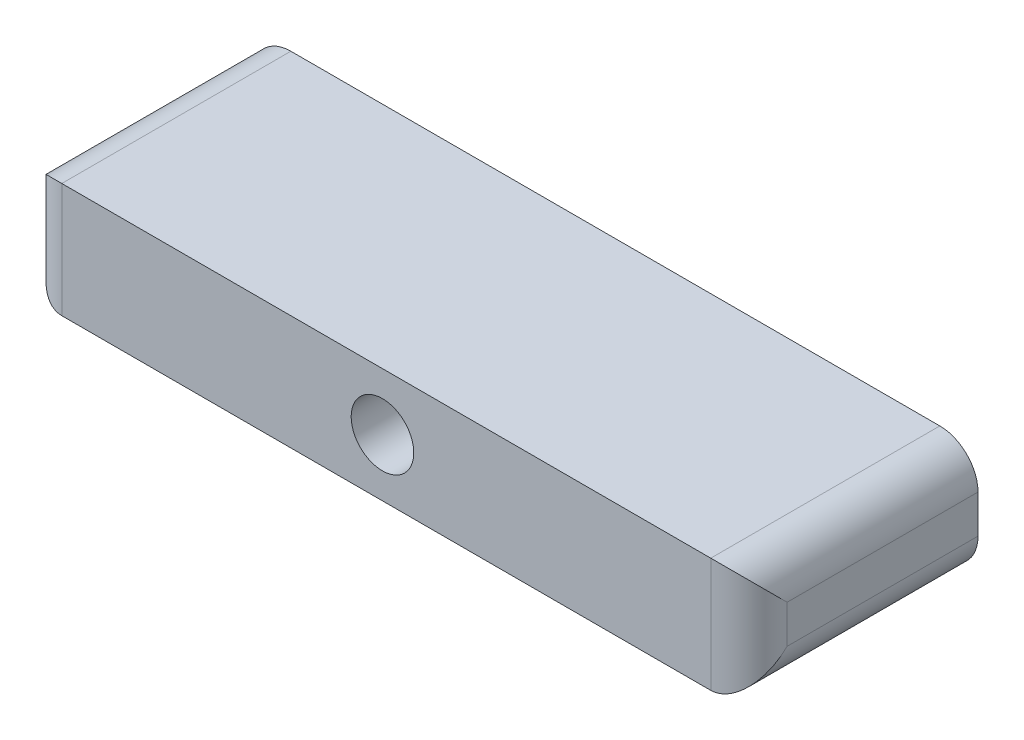
ISO-10303-21;
HEADER;
FILE_DESCRIPTION(('STEP AP214'),'2;1');
FILE_NAME('part.step','',(''),(''),'','','');
FILE_SCHEMA(('AUTOMOTIVE_DESIGN { 1 0 10303 214 1 1 1 1 }'));
ENDSEC;
DATA;
#1=APPLICATION_CONTEXT('core data for automotive mechanical design processes');
#2=APPLICATION_PROTOCOL_DEFINITION('international standard','automotive_design',2000,#1);
#3=PRODUCT_CONTEXT('',#1,'mechanical');
#4=PRODUCT('Part','Part','',(#3));
#5=PRODUCT_RELATED_PRODUCT_CATEGORY('part','',(#4));
#6=PRODUCT_DEFINITION_FORMATION('','',#4);
#7=PRODUCT_DEFINITION_CONTEXT('part definition',#1,'design');
#8=PRODUCT_DEFINITION('design','',#6,#7);
#9=PRODUCT_DEFINITION_SHAPE('','',#8);
#10=(LENGTH_UNIT() NAMED_UNIT(*) SI_UNIT(.MILLI.,.METRE.));
#11=(NAMED_UNIT(*) PLANE_ANGLE_UNIT() SI_UNIT($,.RADIAN.));
#12=(NAMED_UNIT(*) SI_UNIT($,.STERADIAN.) SOLID_ANGLE_UNIT());
#13=UNCERTAINTY_MEASURE_WITH_UNIT(LENGTH_MEASURE(1.E-05),#10,'distance_accuracy_value','');
#14=(GEOMETRIC_REPRESENTATION_CONTEXT(3) GLOBAL_UNCERTAINTY_ASSIGNED_CONTEXT((#13)) GLOBAL_UNIT_ASSIGNED_CONTEXT((#10,
#11,#12)) REPRESENTATION_CONTEXT('',''));
#15=CARTESIAN_POINT('',(0.,0.,0.));
#16=DIRECTION('',(0.,0.,1.));
#17=DIRECTION('',(1.,0.,0.));
#18=AXIS2_PLACEMENT_3D('',#15,#16,#17);
#19=CARTESIAN_POINT('',(0.,15.,0.));
#20=DIRECTION('',(-1.,0.,0.));
#21=DIRECTION('',(0.,0.,1.));
#22=AXIS2_PLACEMENT_3D('',#19,#20,#21);
#23=PLANE('',#22);
#24=DIRECTION('',(0.,-1.,0.));
#25=VECTOR('',#24,1.);
#26=CARTESIAN_POINT('',(0.,15.,25.));
#27=LINE('',#26,#25);
#28=CARTESIAN_POINT('',(0.,10.,25.));
#29=VERTEX_POINT('',#28);
#30=CARTESIAN_POINT('',(0.,5.,25.));
#31=VERTEX_POINT('',#30);
#32=EDGE_CURVE('E57',#29,#31,#27,.T.);
#33=ORIENTED_EDGE('',*,*,#32,.T.);
#34=DIRECTION('',(0.,0.,-1.));
#35=VECTOR('',#34,1.);
#36=CARTESIAN_POINT('',(0.,5.,0.));
#37=LINE('',#36,#35);
#38=CARTESIAN_POINT('',(0.,5.,0.));
#39=VERTEX_POINT('',#38);
#40=EDGE_CURVE('E156',#31,#39,#37,.T.);
#41=ORIENTED_EDGE('',*,*,#40,.T.);
#42=DIRECTION('',(0.,-1.,0.));
#43=VECTOR('',#42,1.);
#44=CARTESIAN_POINT('',(0.,15.,0.));
#45=LINE('',#44,#43);
#46=CARTESIAN_POINT('',(0.,10.,0.));
#47=VERTEX_POINT('',#46);
#48=EDGE_CURVE('E131',#47,#39,#45,.T.);
#49=ORIENTED_EDGE('',*,*,#48,.F.);
#50=DIRECTION('',(0.,0.,-1.));
#51=VECTOR('',#50,1.);
#52=CARTESIAN_POINT('',(0.,10.,0.));
#53=LINE('',#52,#51);
#54=EDGE_CURVE('E62',#47,#29,#53,.F.);
#55=ORIENTED_EDGE('',*,*,#54,.T.);
#56=EDGE_LOOP('',(#33,#41,#49,#55));
#57=FACE_BOUND('',#56,.T.);
#58=ADVANCED_FACE('F39',(#57),#23,.F.);
#59=CARTESIAN_POINT('',(0.,15.,0.));
#60=DIRECTION('',(0.,0.,1.));
#61=DIRECTION('',(1.,0.,0.));
#62=AXIS2_PLACEMENT_3D('',#59,#60,#61);
#63=PLANE('',#62);
#64=CARTESIAN_POINT('',(-48.,7.5,0.));
#65=DIRECTION('',(0.,0.,-1.));
#66=DIRECTION('',(-1.,0.,0.));
#67=AXIS2_PLACEMENT_3D('',#64,#65,#66);
#68=CIRCLE('',#67,4.1);
#69=CARTESIAN_POINT('',(-52.1,7.5,0.));
#70=VERTEX_POINT('',#69);
#71=EDGE_CURVE('E166',#70,#70,#68,.T.);
#72=ORIENTED_EDGE('',*,*,#71,.F.);
#73=EDGE_LOOP('',(#72));
#74=FACE_BOUND('',#73,.T.);
#75=CARTESIAN_POINT('',(-10.,7.,0.));
#76=DIRECTION('',(0.,0.,-1.));
#77=DIRECTION('',(-1.,0.,0.));
#78=AXIS2_PLACEMENT_3D('',#75,#76,#77);
#79=CIRCLE('',#78,4.25);
#80=CARTESIAN_POINT('',(-14.25,7.,0.));
#81=VERTEX_POINT('',#80);
#82=EDGE_CURVE('E387',#81,#81,#79,.T.);
#83=ORIENTED_EDGE('',*,*,#82,.F.);
#84=EDGE_LOOP('',(#83));
#85=FACE_BOUND('',#84,.T.);
#86=CARTESIAN_POINT('',(-85.,7.,0.));
#87=DIRECTION('',(0.,0.,-1.));
#88=DIRECTION('',(-1.,0.,0.));
#89=AXIS2_PLACEMENT_3D('',#86,#87,#88);
#90=CIRCLE('',#89,4.25000000000001);
#91=CARTESIAN_POINT('',(-89.25,7.,0.));
#92=VERTEX_POINT('',#91);
#93=EDGE_CURVE('E197',#92,#92,#90,.T.);
#94=ORIENTED_EDGE('',*,*,#93,.F.);
#95=EDGE_LOOP('',(#94));
#96=FACE_BOUND('',#95,.T.);
#97=DIRECTION('',(-1.,0.,0.));
#98=VECTOR('',#97,1.);
#99=CARTESIAN_POINT('',(0.,0.,0.));
#100=LINE('',#99,#98);
#101=CARTESIAN_POINT('',(-5.,0.,0.));
#102=VERTEX_POINT('',#101);
#103=CARTESIAN_POINT('',(-90.,0.,0.));
#104=VERTEX_POINT('',#103);
#105=EDGE_CURVE('E194',#102,#104,#100,.T.);
#106=ORIENTED_EDGE('',*,*,#105,.T.);
#107=CARTESIAN_POINT('',(-90.,5.,0.));
#108=DIRECTION('',(0.,0.,1.));
#109=DIRECTION('',(1.,0.,0.));
#110=AXIS2_PLACEMENT_3D('',#107,#108,#109);
#111=CIRCLE('',#110,5.);
#112=CARTESIAN_POINT('',(-95.,5.,0.));
#113=VERTEX_POINT('',#112);
#114=EDGE_CURVE('E129',#104,#113,#111,.F.);
#115=ORIENTED_EDGE('',*,*,#114,.T.);
#116=DIRECTION('',(0.,-1.,0.));
#117=VECTOR('',#116,1.);
#118=CARTESIAN_POINT('',(-95.,15.,0.));
#119=LINE('',#118,#117);
#120=CARTESIAN_POINT('',(-95.,10.,0.));
#121=VERTEX_POINT('',#120);
#122=EDGE_CURVE('E111',#121,#113,#119,.T.);
#123=ORIENTED_EDGE('',*,*,#122,.F.);
#124=CARTESIAN_POINT('',(-90.,10.,0.));
#125=DIRECTION('',(0.,0.,1.));
#126=DIRECTION('',(1.,0.,0.));
#127=AXIS2_PLACEMENT_3D('',#124,#125,#126);
#128=CIRCLE('',#127,5.);
#129=CARTESIAN_POINT('',(-90.,15.,0.));
#130=VERTEX_POINT('',#129);
#131=EDGE_CURVE('E126',#121,#130,#128,.F.);
#132=ORIENTED_EDGE('',*,*,#131,.T.);
#133=DIRECTION('',(-1.,0.,0.));
#134=VECTOR('',#133,1.);
#135=CARTESIAN_POINT('',(0.,15.,0.));
#136=LINE('',#135,#134);
#137=CARTESIAN_POINT('',(-5.,15.,0.));
#138=VERTEX_POINT('',#137);
#139=EDGE_CURVE('E184',#138,#130,#136,.T.);
#140=ORIENTED_EDGE('',*,*,#139,.F.);
#141=CARTESIAN_POINT('',(-5.,10.,0.));
#142=DIRECTION('',(0.,0.,1.));
#143=DIRECTION('',(1.,0.,0.));
#144=AXIS2_PLACEMENT_3D('',#141,#142,#143);
#145=CIRCLE('',#144,5.);
#146=EDGE_CURVE('E144',#138,#47,#145,.F.);
#147=ORIENTED_EDGE('',*,*,#146,.T.);
#148=ORIENTED_EDGE('',*,*,#48,.T.);
#149=CARTESIAN_POINT('',(-5.,5.,0.));
#150=DIRECTION('',(0.,0.,1.));
#151=DIRECTION('',(1.,0.,0.));
#152=AXIS2_PLACEMENT_3D('',#149,#150,#151);
#153=CIRCLE('',#152,5.);
#154=EDGE_CURVE('E138',#39,#102,#153,.F.);
#155=ORIENTED_EDGE('',*,*,#154,.T.);
#156=EDGE_LOOP('',(#106,#115,#123,#132,#140,#147,#148,#155));
#157=FACE_BOUND('',#156,.T.);
#158=ADVANCED_FACE('F124',(#74,#85,#96,#157),#63,.F.);
#159=CARTESIAN_POINT('',(-95.,15.,0.));
#160=DIRECTION('',(1.,0.,0.));
#161=DIRECTION('',(0.,0.,-1.));
#162=AXIS2_PLACEMENT_3D('',#159,#160,#161);
#163=PLANE('',#162);
#164=ORIENTED_EDGE('',*,*,#122,.T.);
#165=DIRECTION('',(0.,0.,1.));
#166=VECTOR('',#165,1.);
#167=CARTESIAN_POINT('',(-95.,5.,30.));
#168=LINE('',#167,#166);
#169=CARTESIAN_POINT('',(-95.,5.,25.));
#170=VERTEX_POINT('',#169);
#171=EDGE_CURVE('E120',#113,#170,#168,.T.);
#172=ORIENTED_EDGE('',*,*,#171,.T.);
#173=DIRECTION('',(0.,-1.,0.));
#174=VECTOR('',#173,1.);
#175=CARTESIAN_POINT('',(-95.,15.,25.));
#176=LINE('',#175,#174);
#177=CARTESIAN_POINT('',(-95.,10.,25.));
#178=VERTEX_POINT('',#177);
#179=EDGE_CURVE('E114',#170,#178,#176,.F.);
#180=ORIENTED_EDGE('',*,*,#179,.T.);
#181=DIRECTION('',(0.,0.,1.));
#182=VECTOR('',#181,1.);
#183=CARTESIAN_POINT('',(-95.,10.,0.));
#184=LINE('',#183,#182);
#185=EDGE_CURVE('E107',#178,#121,#184,.F.);
#186=ORIENTED_EDGE('',*,*,#185,.T.);
#187=EDGE_LOOP('',(#164,#172,#180,#186));
#188=FACE_BOUND('',#187,.T.);
#189=ADVANCED_FACE('F109',(#188),#163,.F.);
#190=CARTESIAN_POINT('',(0.,15.,30.));
#191=DIRECTION('',(0.,0.,-1.));
#192=DIRECTION('',(-1.,0.,0.));
#193=AXIS2_PLACEMENT_3D('',#190,#191,#192);
#194=PLANE('',#193);
#195=CARTESIAN_POINT('',(-48.,7.5,30.));
#196=DIRECTION('',(0.,0.,-1.));
#197=DIRECTION('',(-1.,0.,0.));
#198=AXIS2_PLACEMENT_3D('',#195,#196,#197);
#199=CIRCLE('',#198,4.1);
#200=CARTESIAN_POINT('',(-52.1,7.5,30.));
#201=VERTEX_POINT('',#200);
#202=EDGE_CURVE('E384',#201,#201,#199,.F.);
#203=ORIENTED_EDGE('',*,*,#202,.F.);
#204=EDGE_LOOP('',(#203));
#205=FACE_BOUND('',#204,.T.);
#206=DIRECTION('',(1.,0.,0.));
#207=VECTOR('',#206,1.);
#208=CARTESIAN_POINT('',(0.,15.,30.));
#209=LINE('',#208,#207);
#210=CARTESIAN_POINT('',(-90.,15.,30.));
#211=VERTEX_POINT('',#210);
#212=CARTESIAN_POINT('',(-5.,15.,30.));
#213=VERTEX_POINT('',#212);
#214=EDGE_CURVE('E132',#211,#213,#209,.T.);
#215=ORIENTED_EDGE('',*,*,#214,.F.);
#216=DIRECTION('',(0.,-1.,0.));
#217=VECTOR('',#216,1.);
#218=CARTESIAN_POINT('',(-90.,15.,30.));
#219=LINE('',#218,#217);
#220=CARTESIAN_POINT('',(-90.,0.,30.));
#221=VERTEX_POINT('',#220);
#222=EDGE_CURVE('E11',#211,#221,#219,.T.);
#223=ORIENTED_EDGE('',*,*,#222,.T.);
#224=DIRECTION('',(1.,0.,0.));
#225=VECTOR('',#224,1.);
#226=CARTESIAN_POINT('',(0.,0.,30.));
#227=LINE('',#226,#225);
#228=CARTESIAN_POINT('',(-5.,0.,30.));
#229=VERTEX_POINT('',#228);
#230=EDGE_CURVE('E188',#221,#229,#227,.T.);
#231=ORIENTED_EDGE('',*,*,#230,.T.);
#232=DIRECTION('',(0.,-1.,0.));
#233=VECTOR('',#232,1.);
#234=CARTESIAN_POINT('',(-5.,15.,30.));
#235=LINE('',#234,#233);
#236=EDGE_CURVE('E49',#229,#213,#235,.F.);
#237=ORIENTED_EDGE('',*,*,#236,.T.);
#238=EDGE_LOOP('',(#215,#223,#231,#237));
#239=FACE_BOUND('',#238,.T.);
#240=ADVANCED_FACE('F227',(#205,#239),#194,.F.);
#241=CARTESIAN_POINT('',(0.,15.,0.));
#242=DIRECTION('',(0.,-1.,0.));
#243=DIRECTION('',(0.,0.,-1.));
#244=AXIS2_PLACEMENT_3D('',#241,#242,#243);
#245=PLANE('',#244);
#246=ORIENTED_EDGE('',*,*,#139,.T.);
#247=DIRECTION('',(0.,0.,1.));
#248=VECTOR('',#247,1.);
#249=CARTESIAN_POINT('',(-90.,15.,0.));
#250=LINE('',#249,#248);
#251=EDGE_CURVE('E136',#130,#211,#250,.T.);
#252=ORIENTED_EDGE('',*,*,#251,.T.);
#253=ORIENTED_EDGE('',*,*,#214,.T.);
#254=DIRECTION('',(0.,0.,-1.));
#255=VECTOR('',#254,1.);
#256=CARTESIAN_POINT('',(-5.,15.,0.));
#257=LINE('',#256,#255);
#258=EDGE_CURVE('E142',#213,#138,#257,.T.);
#259=ORIENTED_EDGE('',*,*,#258,.T.);
#260=EDGE_LOOP('',(#246,#252,#253,#259));
#261=FACE_BOUND('',#260,.T.);
#262=ADVANCED_FACE('F183',(#261),#245,.F.);
#263=CARTESIAN_POINT('',(0.,0.,0.));
#264=DIRECTION('',(0.,-1.,0.));
#265=DIRECTION('',(0.,0.,-1.));
#266=AXIS2_PLACEMENT_3D('',#263,#264,#265);
#267=PLANE('',#266);
#268=ORIENTED_EDGE('',*,*,#230,.F.);
#269=DIRECTION('',(0.,0.,1.));
#270=VECTOR('',#269,1.);
#271=CARTESIAN_POINT('',(-90.,0.,0.));
#272=LINE('',#271,#270);
#273=EDGE_CURVE('E212',#221,#104,#272,.F.);
#274=ORIENTED_EDGE('',*,*,#273,.T.);
#275=ORIENTED_EDGE('',*,*,#105,.F.);
#276=DIRECTION('',(0.,0.,-1.));
#277=VECTOR('',#276,1.);
#278=CARTESIAN_POINT('',(-5.,0.,30.));
#279=LINE('',#278,#277);
#280=EDGE_CURVE('E209',#102,#229,#279,.F.);
#281=ORIENTED_EDGE('',*,*,#280,.T.);
#282=EDGE_LOOP('',(#268,#274,#275,#281));
#283=FACE_BOUND('',#282,.T.);
#284=ADVANCED_FACE('F219',(#283),#267,.T.);
#285=CARTESIAN_POINT('',(-85.,7.,20.));
#286=DIRECTION('',(0.,0.,-1.));
#287=DIRECTION('',(-1.,0.,0.));
#288=AXIS2_PLACEMENT_3D('',#285,#286,#287);
#289=CYLINDRICAL_SURFACE('',#288,4.25000000000001);
#290=CARTESIAN_POINT('',(-85.,7.,20.));
#291=DIRECTION('',(0.,0.,-1.));
#292=DIRECTION('',(-1.,0.,0.));
#293=AXIS2_PLACEMENT_3D('',#290,#291,#292);
#294=CIRCLE('',#293,4.25000000000001);
#295=CARTESIAN_POINT('',(-89.25,7.,20.));
#296=VERTEX_POINT('',#295);
#297=EDGE_CURVE('E379',#296,#296,#294,.T.);
#298=ORIENTED_EDGE('',*,*,#297,.F.);
#299=EDGE_LOOP('',(#298));
#300=FACE_BOUND('',#299,.T.);
#301=ORIENTED_EDGE('',*,*,#93,.T.);
#302=EDGE_LOOP('',(#301));
#303=FACE_BOUND('',#302,.T.);
#304=ADVANCED_FACE('F305',(#300,#303),#289,.F.);
#305=CARTESIAN_POINT('',(-85.,7.,20.));
#306=DIRECTION('',(0.,0.,-1.));
#307=DIRECTION('',(-1.,0.,0.));
#308=AXIS2_PLACEMENT_3D('',#305,#306,#307);
#309=PLANE('',#308);
#310=ORIENTED_EDGE('',*,*,#297,.T.);
#311=EDGE_LOOP('',(#310));
#312=FACE_BOUND('',#311,.T.);
#313=ADVANCED_FACE('F297',(#312),#309,.T.);
#314=CARTESIAN_POINT('',(-10.,7.,20.));
#315=DIRECTION('',(0.,0.,-1.));
#316=DIRECTION('',(-1.,0.,0.));
#317=AXIS2_PLACEMENT_3D('',#314,#315,#316);
#318=CYLINDRICAL_SURFACE('',#317,4.25);
#319=CARTESIAN_POINT('',(-10.,7.,20.));
#320=DIRECTION('',(0.,0.,-1.));
#321=DIRECTION('',(-1.,0.,0.));
#322=AXIS2_PLACEMENT_3D('',#319,#320,#321);
#323=CIRCLE('',#322,4.25);
#324=CARTESIAN_POINT('',(-14.25,7.,20.));
#325=VERTEX_POINT('',#324);
#326=EDGE_CURVE('E201',#325,#325,#323,.T.);
#327=ORIENTED_EDGE('',*,*,#326,.F.);
#328=EDGE_LOOP('',(#327));
#329=FACE_BOUND('',#328,.T.);
#330=ORIENTED_EDGE('',*,*,#82,.T.);
#331=EDGE_LOOP('',(#330));
#332=FACE_BOUND('',#331,.T.);
#333=ADVANCED_FACE('F289',(#329,#332),#318,.F.);
#334=CARTESIAN_POINT('',(-10.,7.,20.));
#335=DIRECTION('',(0.,0.,-1.));
#336=DIRECTION('',(-1.,0.,0.));
#337=AXIS2_PLACEMENT_3D('',#334,#335,#336);
#338=PLANE('',#337);
#339=ORIENTED_EDGE('',*,*,#326,.T.);
#340=EDGE_LOOP('',(#339));
#341=FACE_BOUND('',#340,.T.);
#342=ADVANCED_FACE('F281',(#341),#338,.T.);
#343=CARTESIAN_POINT('',(-48.,7.5,30.001));
#344=DIRECTION('',(0.,0.,-1.));
#345=DIRECTION('',(-1.,0.,0.));
#346=AXIS2_PLACEMENT_3D('',#343,#344,#345);
#347=CYLINDRICAL_SURFACE('',#346,4.1);
#348=CARTESIAN_POINT('',(-52.1,7.5,0.));
#349=CARTESIAN_POINT('',(-52.1,7.5,0.312500000000008));
#350=CARTESIAN_POINT('',(-52.1,7.5,0.625000000000008));
#351=CARTESIAN_POINT('',(-52.1,7.5,1.25000000000001));
#352=CARTESIAN_POINT('',(-52.1,7.5,1.56250000000001));
#353=CARTESIAN_POINT('',(-52.1,7.5,2.18750000000001));
#354=CARTESIAN_POINT('',(-52.1,7.5,2.50000000000001));
#355=CARTESIAN_POINT('',(-52.1,7.5,3.12500000000001));
#356=CARTESIAN_POINT('',(-52.1,7.5,3.43750000000001));
#357=CARTESIAN_POINT('',(-52.1,7.5,4.06250000000001));
#358=CARTESIAN_POINT('',(-52.1,7.5,4.37500000000001));
#359=CARTESIAN_POINT('',(-52.1,7.5,5.00000000000001));
#360=CARTESIAN_POINT('',(-52.1,7.5,5.31250000000001));
#361=CARTESIAN_POINT('',(-52.1,7.5,5.93750000000001));
#362=CARTESIAN_POINT('',(-52.1,7.5,6.25000000000001));
#363=CARTESIAN_POINT('',(-52.1,7.5,6.87500000000001));
#364=CARTESIAN_POINT('',(-52.1,7.5,7.18750000000001));
#365=CARTESIAN_POINT('',(-52.1,7.5,7.81250000000001));
#366=CARTESIAN_POINT('',(-52.1,7.5,8.12500000000001));
#367=CARTESIAN_POINT('',(-52.1,7.5,8.75000000000001));
#368=CARTESIAN_POINT('',(-52.1,7.5,9.06250000000001));
#369=CARTESIAN_POINT('',(-52.1,7.5,9.68750000000001));
#370=CARTESIAN_POINT('',(-52.1,7.5,10.));
#371=CARTESIAN_POINT('',(-52.1,7.5,10.625));
#372=CARTESIAN_POINT('',(-52.1,7.5,10.9375));
#373=CARTESIAN_POINT('',(-52.1,7.5,11.5625));
#374=CARTESIAN_POINT('',(-52.1,7.5,11.875));
#375=CARTESIAN_POINT('',(-52.1,7.5,12.5));
#376=CARTESIAN_POINT('',(-52.1,7.5,12.8125));
#377=CARTESIAN_POINT('',(-52.1,7.5,13.4375));
#378=CARTESIAN_POINT('',(-52.1,7.5,13.75));
#379=CARTESIAN_POINT('',(-52.1,7.5,14.375));
#380=CARTESIAN_POINT('',(-52.1,7.5,14.6875));
#381=CARTESIAN_POINT('',(-52.1,7.5,15.3125));
#382=CARTESIAN_POINT('',(-52.1,7.5,15.625));
#383=CARTESIAN_POINT('',(-52.1,7.5,16.25));
#384=CARTESIAN_POINT('',(-52.1,7.5,16.5625));
#385=CARTESIAN_POINT('',(-52.1,7.5,17.1875));
#386=CARTESIAN_POINT('',(-52.1,7.5,17.5));
#387=CARTESIAN_POINT('',(-52.1,7.5,18.125));
#388=CARTESIAN_POINT('',(-52.1,7.5,18.4375));
#389=CARTESIAN_POINT('',(-52.1,7.5,19.0625));
#390=CARTESIAN_POINT('',(-52.1,7.5,19.375));
#391=CARTESIAN_POINT('',(-52.1,7.5,20.));
#392=CARTESIAN_POINT('',(-52.1,7.5,20.3125));
#393=CARTESIAN_POINT('',(-52.1,7.5,20.9375));
#394=CARTESIAN_POINT('',(-52.1,7.5,21.25));
#395=CARTESIAN_POINT('',(-52.1,7.5,21.875));
#396=CARTESIAN_POINT('',(-52.1,7.5,22.1875));
#397=CARTESIAN_POINT('',(-52.1,7.5,22.8125));
#398=CARTESIAN_POINT('',(-52.1,7.5,23.125));
#399=CARTESIAN_POINT('',(-52.1,7.5,23.75));
#400=CARTESIAN_POINT('',(-52.1,7.5,24.0625));
#401=CARTESIAN_POINT('',(-52.1,7.5,24.6875));
#402=CARTESIAN_POINT('',(-52.1,7.5,25.));
#403=CARTESIAN_POINT('',(-52.1,7.5,25.625));
#404=CARTESIAN_POINT('',(-52.1,7.5,25.9375));
#405=CARTESIAN_POINT('',(-52.1,7.5,26.5625));
#406=CARTESIAN_POINT('',(-52.1,7.5,26.875));
#407=CARTESIAN_POINT('',(-52.1,7.5,27.5));
#408=CARTESIAN_POINT('',(-52.1,7.5,27.8125));
#409=CARTESIAN_POINT('',(-52.1,7.5,28.4375));
#410=CARTESIAN_POINT('',(-52.1,7.5,28.75));
#411=CARTESIAN_POINT('',(-52.1,7.5,29.375));
#412=CARTESIAN_POINT('',(-52.1,7.5,29.6875));
#413=CARTESIAN_POINT('',(-52.1,7.5,30.));
#414=B_SPLINE_CURVE_WITH_KNOTS('',3,(#348,#349,#350,#351,#352,#353,#354,#355,#356,#357,#358,
#359,#360,#361,#362,#363,#364,#365,#366,#367,#368,#369,#370,#371,#372,#373,#374,#375,#376,#377,
#378,#379,#380,#381,#382,#383,#384,#385,#386,#387,#388,#389,#390,#391,#392,#393,#394,#395,#396,
#397,#398,#399,#400,#401,#402,#403,#404,#405,#406,#407,#408,#409,#410,#411,#412,#413),
.UNSPECIFIED.,.F.,.F.,(4,2,2,2,2,2,2,2,2,2,2,2,2,2,2,2,2,2,2,2,2,2,2,2,2,2,2,2,2,2,2,2,4),(0.,
0.937500000000001,1.875,2.8125,3.75,4.6875,5.625,6.5625,7.5,8.4375,9.375,10.3125,11.25,12.1875,
13.125,14.0625,15.,15.9375,16.875,17.8125,18.75,19.6875,20.625,21.5625,22.5,23.4375,24.375,
25.3125,26.25,27.1875,28.125,29.0625,30.),.UNSPECIFIED.);
#415=EDGE_CURVE('BSEAM253',#70,#201,#414,.T.);
#416=ORIENTED_EDGE('',*,*,#71,.T.);
#417=ORIENTED_EDGE('',*,*,#202,.T.);
#418=ORIENTED_EDGE('',*,*,#415,.T.);
#419=ORIENTED_EDGE('',*,*,#415,.F.);
#420=EDGE_LOOP('',(#416,#418,#417,#419));
#421=FACE_BOUND('',#420,.T.);
#422=ADVANCED_FACE('F253',(#421),#347,.F.);
#423=CARTESIAN_POINT('',(-90.,10.,0.));
#424=DIRECTION('',(0.,0.,1.));
#425=DIRECTION('',(1.,0.,0.));
#426=AXIS2_PLACEMENT_3D('',#423,#424,#425);
#427=CYLINDRICAL_SURFACE('',#426,5.);
#428=ORIENTED_EDGE('',*,*,#131,.F.);
#429=ORIENTED_EDGE('',*,*,#185,.F.);
#430=CARTESIAN_POINT('',(-90.,10.,25.));
#431=DIRECTION('',(0.,-0.707106781186547,0.707106781186547));
#432=DIRECTION('',(0.,-0.707106781186547,-0.707106781186547));
#433=AXIS2_PLACEMENT_3D('',#430,#431,#432);
#434=ELLIPSE('',#433,7.07106781186547,5.);
#435=EDGE_CURVE('E164',#211,#178,#434,.T.);
#436=ORIENTED_EDGE('',*,*,#435,.F.);
#437=ORIENTED_EDGE('',*,*,#251,.F.);
#438=EDGE_LOOP('',(#428,#429,#436,#437));
#439=FACE_BOUND('',#438,.T.);
#440=ADVANCED_FACE('F135',(#439),#427,.T.);
#441=CARTESIAN_POINT('',(-90.,15.,25.));
#442=DIRECTION('',(0.,-1.,0.));
#443=DIRECTION('',(0.,0.,-1.));
#444=AXIS2_PLACEMENT_3D('',#441,#442,#443);
#445=CYLINDRICAL_SURFACE('',#444,5.);
#446=ORIENTED_EDGE('',*,*,#435,.T.);
#447=ORIENTED_EDGE('',*,*,#179,.F.);
#448=CARTESIAN_POINT('',(-90.,5.,25.));
#449=DIRECTION('',(0.,-0.707106781186547,-0.707106781186547));
#450=DIRECTION('',(0.,-0.707106781186547,0.707106781186547));
#451=AXIS2_PLACEMENT_3D('',#448,#449,#450);
#452=ELLIPSE('',#451,7.07106781186547,5.);
#453=EDGE_CURVE('E161',#221,#170,#452,.T.);
#454=ORIENTED_EDGE('',*,*,#453,.F.);
#455=ORIENTED_EDGE('',*,*,#222,.F.);
#456=EDGE_LOOP('',(#446,#447,#454,#455));
#457=FACE_BOUND('',#456,.T.);
#458=ADVANCED_FACE('F225',(#457),#445,.T.);
#459=CARTESIAN_POINT('',(-90.,5.,0.));
#460=DIRECTION('',(0.,0.,-1.));
#461=DIRECTION('',(-1.,0.,0.));
#462=AXIS2_PLACEMENT_3D('',#459,#460,#461);
#463=CYLINDRICAL_SURFACE('',#462,5.);
#464=ORIENTED_EDGE('',*,*,#114,.F.);
#465=ORIENTED_EDGE('',*,*,#273,.F.);
#466=ORIENTED_EDGE('',*,*,#453,.T.);
#467=ORIENTED_EDGE('',*,*,#171,.F.);
#468=EDGE_LOOP('',(#464,#465,#466,#467));
#469=FACE_BOUND('',#468,.T.);
#470=ADVANCED_FACE('F222',(#469),#463,.T.);
#471=CARTESIAN_POINT('',(-5.,10.,0.));
#472=DIRECTION('',(0.,0.,-1.));
#473=DIRECTION('',(-1.,0.,0.));
#474=AXIS2_PLACEMENT_3D('',#471,#472,#473);
#475=CYLINDRICAL_SURFACE('',#474,5.);
#476=ORIENTED_EDGE('',*,*,#146,.F.);
#477=ORIENTED_EDGE('',*,*,#258,.F.);
#478=CARTESIAN_POINT('',(-5.,10.,25.));
#479=DIRECTION('',(0.,-0.707106781186547,0.707106781186547));
#480=DIRECTION('',(0.,-0.707106781186547,-0.707106781186547));
#481=AXIS2_PLACEMENT_3D('',#478,#479,#480);
#482=ELLIPSE('',#481,7.07106781186547,5.);
#483=EDGE_CURVE('E43',#29,#213,#482,.T.);
#484=ORIENTED_EDGE('',*,*,#483,.F.);
#485=ORIENTED_EDGE('',*,*,#54,.F.);
#486=EDGE_LOOP('',(#476,#477,#484,#485));
#487=FACE_BOUND('',#486,.T.);
#488=ADVANCED_FACE('F41',(#487),#475,.T.);
#489=CARTESIAN_POINT('',(-5.,15.,25.));
#490=DIRECTION('',(0.,-1.,0.));
#491=DIRECTION('',(0.,0.,-1.));
#492=AXIS2_PLACEMENT_3D('',#489,#490,#491);
#493=CYLINDRICAL_SURFACE('',#492,5.);
#494=ORIENTED_EDGE('',*,*,#483,.T.);
#495=ORIENTED_EDGE('',*,*,#236,.F.);
#496=CARTESIAN_POINT('',(-5.,5.,25.));
#497=DIRECTION('',(0.,-0.707106781186547,-0.707106781186547));
#498=DIRECTION('',(0.,-0.707106781186547,0.707106781186547));
#499=AXIS2_PLACEMENT_3D('',#496,#497,#498);
#500=ELLIPSE('',#499,7.07106781186547,5.);
#501=EDGE_CURVE('E167',#31,#229,#500,.T.);
#502=ORIENTED_EDGE('',*,*,#501,.F.);
#503=ORIENTED_EDGE('',*,*,#32,.F.);
#504=EDGE_LOOP('',(#494,#495,#502,#503));
#505=FACE_BOUND('',#504,.T.);
#506=ADVANCED_FACE('F177',(#505),#493,.T.);
#507=CARTESIAN_POINT('',(-5.,5.,0.));
#508=DIRECTION('',(0.,0.,1.));
#509=DIRECTION('',(1.,0.,0.));
#510=AXIS2_PLACEMENT_3D('',#507,#508,#509);
#511=CYLINDRICAL_SURFACE('',#510,5.);
#512=ORIENTED_EDGE('',*,*,#501,.T.);
#513=ORIENTED_EDGE('',*,*,#280,.F.);
#514=ORIENTED_EDGE('',*,*,#154,.F.);
#515=ORIENTED_EDGE('',*,*,#40,.F.);
#516=EDGE_LOOP('',(#512,#513,#514,#515));
#517=FACE_BOUND('',#516,.T.);
#518=ADVANCED_FACE('F254',(#517),#511,.T.);
#519=CLOSED_SHELL('',(#58,#158,#189,#240,#262,#284,#304,#313,#333,#342,#422,#440,#458,#470,#488,
#506,#518));
#520=MANIFOLD_SOLID_BREP('B2',#519);
#521=ADVANCED_BREP_SHAPE_REPRESENTATION('',(#18,#520),#14);
#522=SHAPE_DEFINITION_REPRESENTATION(#9,#521);
ENDSEC;
END-ISO-10303-21;
